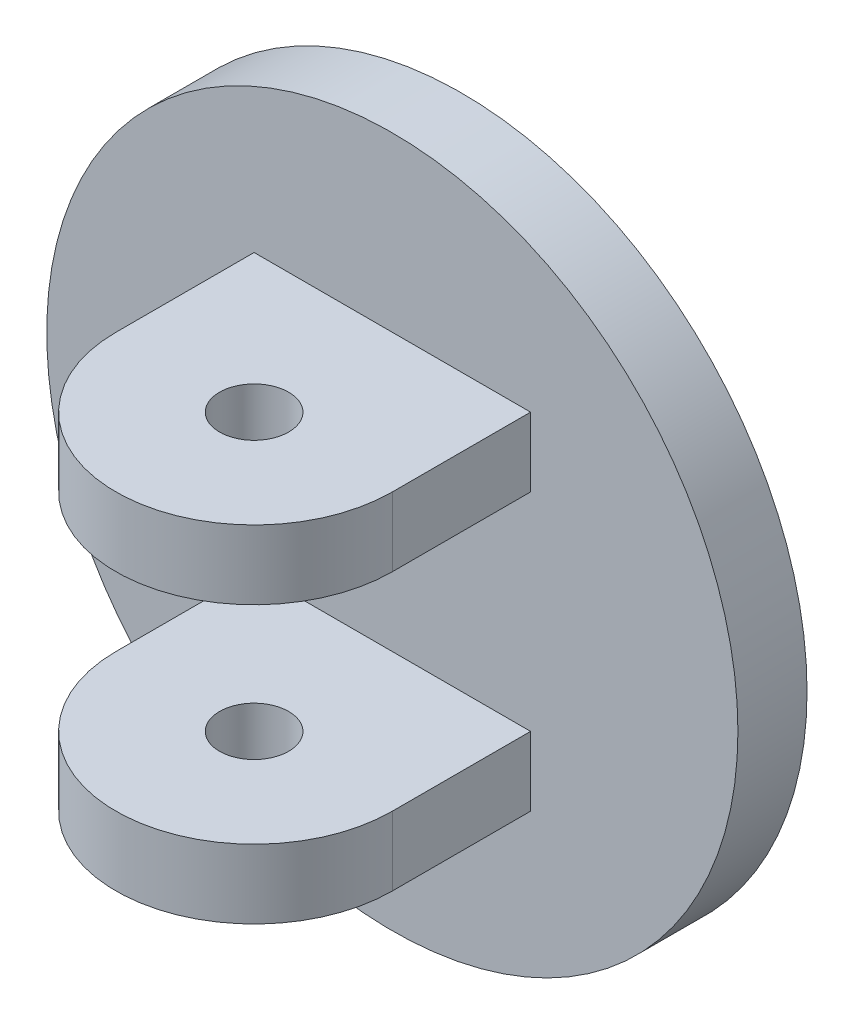
ISO-10303-21;
HEADER;
FILE_DESCRIPTION(('STEP AP214'),'2;1');
FILE_NAME('part.step','',(''),(''),'','','');
FILE_SCHEMA(('AUTOMOTIVE_DESIGN { 1 0 10303 214 1 1 1 1 }'));
ENDSEC;
DATA;
#1=APPLICATION_CONTEXT('core data for automotive mechanical design processes');
#2=APPLICATION_PROTOCOL_DEFINITION('international standard','automotive_design',2000,#1);
#3=PRODUCT_CONTEXT('',#1,'mechanical');
#4=PRODUCT('Part','Part','',(#3));
#5=PRODUCT_RELATED_PRODUCT_CATEGORY('part','',(#4));
#6=PRODUCT_DEFINITION_FORMATION('','',#4);
#7=PRODUCT_DEFINITION_CONTEXT('part definition',#1,'design');
#8=PRODUCT_DEFINITION('design','',#6,#7);
#9=PRODUCT_DEFINITION_SHAPE('','',#8);
#10=(LENGTH_UNIT() NAMED_UNIT(*) SI_UNIT(.MILLI.,.METRE.));
#11=(NAMED_UNIT(*) PLANE_ANGLE_UNIT() SI_UNIT($,.RADIAN.));
#12=(NAMED_UNIT(*) SI_UNIT($,.STERADIAN.) SOLID_ANGLE_UNIT());
#13=UNCERTAINTY_MEASURE_WITH_UNIT(LENGTH_MEASURE(1.E-05),#10,'distance_accuracy_value','');
#14=(GEOMETRIC_REPRESENTATION_CONTEXT(3) GLOBAL_UNCERTAINTY_ASSIGNED_CONTEXT((#13)) GLOBAL_UNIT_ASSIGNED_CONTEXT((#10,
#11,#12)) REPRESENTATION_CONTEXT('',''));
#15=CARTESIAN_POINT('',(0.,0.,0.));
#16=DIRECTION('',(0.,0.,1.));
#17=DIRECTION('',(1.,0.,0.));
#18=AXIS2_PLACEMENT_3D('',#15,#16,#17);
#19=CARTESIAN_POINT('',(20.,15.,50.));
#20=DIRECTION('',(-1.,0.,0.));
#21=DIRECTION('',(0.,0.,1.));
#22=AXIS2_PLACEMENT_3D('',#19,#20,#21);
#23=PLANE('',#22);
#24=DIRECTION('',(0.,1.,0.));
#25=VECTOR('',#24,1.);
#26=CARTESIAN_POINT('',(20.,-76.,30.));
#27=LINE('',#26,#25);
#28=CARTESIAN_POINT('',(20.,15.,30.));
#29=VERTEX_POINT('',#28);
#30=CARTESIAN_POINT('',(20.,25.,30.));
#31=VERTEX_POINT('',#30);
#32=EDGE_CURVE('E110',#29,#31,#27,.T.);
#33=ORIENTED_EDGE('',*,*,#32,.F.);
#34=DIRECTION('',(0.,0.,-1.));
#35=VECTOR('',#34,1.);
#36=CARTESIAN_POINT('',(20.,15.,50.));
#37=LINE('',#36,#35);
#38=CARTESIAN_POINT('',(20.,15.,10.));
#39=VERTEX_POINT('',#38);
#40=EDGE_CURVE('E143',#29,#39,#37,.T.);
#41=ORIENTED_EDGE('',*,*,#40,.T.);
#42=DIRECTION('',(0.,1.,0.));
#43=VECTOR('',#42,1.);
#44=CARTESIAN_POINT('',(20.,15.,10.));
#45=LINE('',#44,#43);
#46=CARTESIAN_POINT('',(20.,25.,10.));
#47=VERTEX_POINT('',#46);
#48=EDGE_CURVE('E127',#39,#47,#45,.T.);
#49=ORIENTED_EDGE('',*,*,#48,.T.);
#50=DIRECTION('',(0.,0.,-1.));
#51=VECTOR('',#50,1.);
#52=CARTESIAN_POINT('',(20.,25.,50.));
#53=LINE('',#52,#51);
#54=EDGE_CURVE('E149',#31,#47,#53,.T.);
#55=ORIENTED_EDGE('',*,*,#54,.F.);
#56=EDGE_LOOP('',(#33,#41,#49,#55));
#57=FACE_BOUND('',#56,.T.);
#58=ADVANCED_FACE('F33',(#57),#23,.F.);
#59=CARTESIAN_POINT('',(0.,25.,50.));
#60=DIRECTION('',(0.,-1.,0.));
#61=DIRECTION('',(1.,0.,0.));
#62=AXIS2_PLACEMENT_3D('',#59,#60,#61);
#63=PLANE('',#62);
#64=CARTESIAN_POINT('',(0.,25.,30.));
#65=DIRECTION('',(0.,-1.,0.));
#66=DIRECTION('',(1.,0.,0.));
#67=AXIS2_PLACEMENT_3D('',#64,#65,#66);
#68=CIRCLE('',#67,5.);
#69=CARTESIAN_POINT('',(5.,25.,30.));
#70=VERTEX_POINT('',#69);
#71=EDGE_CURVE('E201',#70,#70,#68,.F.);
#72=ORIENTED_EDGE('',*,*,#71,.F.);
#73=EDGE_LOOP('',(#72));
#74=FACE_BOUND('',#73,.T.);
#75=CARTESIAN_POINT('',(0.,25.,30.));
#76=DIRECTION('',(0.,-1.,0.));
#77=DIRECTION('',(1.,0.,0.));
#78=AXIS2_PLACEMENT_3D('',#75,#76,#77);
#79=CIRCLE('',#78,20.);
#80=CARTESIAN_POINT('',(-20.,25.,30.));
#81=VERTEX_POINT('',#80);
#82=EDGE_CURVE('E211',#31,#81,#79,.T.);
#83=ORIENTED_EDGE('',*,*,#82,.F.);
#84=ORIENTED_EDGE('',*,*,#54,.T.);
#85=DIRECTION('',(-1.,0.,0.));
#86=VECTOR('',#85,1.);
#87=CARTESIAN_POINT('',(0.,25.,10.));
#88=LINE('',#87,#86);
#89=CARTESIAN_POINT('',(-20.,25.,10.));
#90=VERTEX_POINT('',#89);
#91=EDGE_CURVE('E134',#47,#90,#88,.T.);
#92=ORIENTED_EDGE('',*,*,#91,.T.);
#93=DIRECTION('',(0.,0.,-1.));
#94=VECTOR('',#93,1.);
#95=CARTESIAN_POINT('',(-20.,25.,50.));
#96=LINE('',#95,#94);
#97=EDGE_CURVE('E147',#81,#90,#96,.T.);
#98=ORIENTED_EDGE('',*,*,#97,.F.);
#99=EDGE_LOOP('',(#83,#84,#92,#98));
#100=FACE_BOUND('',#99,.T.);
#101=ADVANCED_FACE('F168',(#74,#100),#63,.F.);
#102=CARTESIAN_POINT('',(-20.,15.,50.));
#103=DIRECTION('',(1.,0.,0.));
#104=DIRECTION('',(0.,0.,-1.));
#105=AXIS2_PLACEMENT_3D('',#102,#103,#104);
#106=PLANE('',#105);
#107=DIRECTION('',(0.,1.,0.));
#108=VECTOR('',#107,1.);
#109=CARTESIAN_POINT('',(-20.,-76.,30.));
#110=LINE('',#109,#108);
#111=CARTESIAN_POINT('',(-20.,15.,30.));
#112=VERTEX_POINT('',#111);
#113=EDGE_CURVE('E50',#112,#81,#110,.T.);
#114=ORIENTED_EDGE('',*,*,#113,.T.);
#115=ORIENTED_EDGE('',*,*,#97,.T.);
#116=DIRECTION('',(0.,-1.,0.));
#117=VECTOR('',#116,1.);
#118=CARTESIAN_POINT('',(-20.,15.,10.));
#119=LINE('',#118,#117);
#120=CARTESIAN_POINT('',(-20.,15.,10.));
#121=VERTEX_POINT('',#120);
#122=EDGE_CURVE('E137',#90,#121,#119,.T.);
#123=ORIENTED_EDGE('',*,*,#122,.T.);
#124=DIRECTION('',(0.,0.,-1.));
#125=VECTOR('',#124,1.);
#126=CARTESIAN_POINT('',(-20.,15.,50.));
#127=LINE('',#126,#125);
#128=EDGE_CURVE('E145',#112,#121,#127,.T.);
#129=ORIENTED_EDGE('',*,*,#128,.F.);
#130=EDGE_LOOP('',(#114,#115,#123,#129));
#131=FACE_BOUND('',#130,.T.);
#132=ADVANCED_FACE('F174',(#131),#106,.F.);
#133=CARTESIAN_POINT('',(0.,15.,50.));
#134=DIRECTION('',(0.,1.,0.));
#135=DIRECTION('',(0.,0.,1.));
#136=AXIS2_PLACEMENT_3D('',#133,#134,#135);
#137=PLANE('',#136);
#138=CARTESIAN_POINT('',(0.,15.,30.));
#139=DIRECTION('',(0.,1.,0.));
#140=DIRECTION('',(0.,0.,1.));
#141=AXIS2_PLACEMENT_3D('',#138,#139,#140);
#142=CIRCLE('',#141,5.);
#143=CARTESIAN_POINT('',(0.,15.,35.));
#144=VERTEX_POINT('',#143);
#145=EDGE_CURVE('E216',#144,#144,#142,.F.);
#146=ORIENTED_EDGE('',*,*,#145,.F.);
#147=EDGE_LOOP('',(#146));
#148=FACE_BOUND('',#147,.T.);
#149=ORIENTED_EDGE('',*,*,#40,.F.);
#150=CARTESIAN_POINT('',(0.,15.,30.));
#151=DIRECTION('',(0.,1.,0.));
#152=DIRECTION('',(0.,0.,1.));
#153=AXIS2_PLACEMENT_3D('',#150,#151,#152);
#154=CIRCLE('',#153,20.);
#155=EDGE_CURVE('E205',#112,#29,#154,.T.);
#156=ORIENTED_EDGE('',*,*,#155,.F.);
#157=ORIENTED_EDGE('',*,*,#128,.T.);
#158=DIRECTION('',(1.,0.,0.));
#159=VECTOR('',#158,1.);
#160=CARTESIAN_POINT('',(0.,15.,10.));
#161=LINE('',#160,#159);
#162=EDGE_CURVE('E140',#121,#39,#161,.T.);
#163=ORIENTED_EDGE('',*,*,#162,.T.);
#164=EDGE_LOOP('',(#149,#156,#157,#163));
#165=FACE_BOUND('',#164,.T.);
#166=ADVANCED_FACE('F228',(#148,#165),#137,.F.);
#167=CARTESIAN_POINT('',(-20.,-15.,50.));
#168=DIRECTION('',(1.,0.,0.));
#169=DIRECTION('',(0.,0.,-1.));
#170=AXIS2_PLACEMENT_3D('',#167,#168,#169);
#171=PLANE('',#170);
#172=CARTESIAN_POINT('',(-20.,-25.,30.));
#173=VERTEX_POINT('',#172);
#174=CARTESIAN_POINT('',(-20.,-15.,30.));
#175=VERTEX_POINT('',#174);
#176=EDGE_CURVE('E101',#173,#175,#110,.T.);
#177=ORIENTED_EDGE('',*,*,#176,.T.);
#178=DIRECTION('',(0.,0.,-1.));
#179=VECTOR('',#178,1.);
#180=CARTESIAN_POINT('',(-20.,-15.,50.));
#181=LINE('',#180,#179);
#182=CARTESIAN_POINT('',(-20.,-15.,10.));
#183=VERTEX_POINT('',#182);
#184=EDGE_CURVE('E125',#175,#183,#181,.T.);
#185=ORIENTED_EDGE('',*,*,#184,.T.);
#186=DIRECTION('',(0.,-1.,0.));
#187=VECTOR('',#186,1.);
#188=CARTESIAN_POINT('',(-20.,-15.,10.));
#189=LINE('',#188,#187);
#190=CARTESIAN_POINT('',(-20.,-25.,10.));
#191=VERTEX_POINT('',#190);
#192=EDGE_CURVE('E123',#183,#191,#189,.T.);
#193=ORIENTED_EDGE('',*,*,#192,.T.);
#194=DIRECTION('',(0.,0.,-1.));
#195=VECTOR('',#194,1.);
#196=CARTESIAN_POINT('',(-20.,-25.,50.));
#197=LINE('',#196,#195);
#198=EDGE_CURVE('E116',#173,#191,#197,.T.);
#199=ORIENTED_EDGE('',*,*,#198,.F.);
#200=EDGE_LOOP('',(#177,#185,#193,#199));
#201=FACE_BOUND('',#200,.T.);
#202=ADVANCED_FACE('F121',(#201),#171,.F.);
#203=CARTESIAN_POINT('',(0.,-25.,50.));
#204=DIRECTION('',(0.,1.,0.));
#205=DIRECTION('',(0.,0.,1.));
#206=AXIS2_PLACEMENT_3D('',#203,#204,#205);
#207=PLANE('',#206);
#208=CARTESIAN_POINT('',(0.,-25.,30.));
#209=DIRECTION('',(0.,1.,0.));
#210=DIRECTION('',(0.,0.,1.));
#211=AXIS2_PLACEMENT_3D('',#208,#209,#210);
#212=CIRCLE('',#211,5.);
#213=CARTESIAN_POINT('',(0.,-25.,35.));
#214=VERTEX_POINT('',#213);
#215=EDGE_CURVE('E213',#214,#214,#212,.F.);
#216=ORIENTED_EDGE('',*,*,#215,.F.);
#217=EDGE_LOOP('',(#216));
#218=FACE_BOUND('',#217,.T.);
#219=DIRECTION('',(0.,0.,-1.));
#220=VECTOR('',#219,1.);
#221=CARTESIAN_POINT('',(20.,-25.,50.));
#222=LINE('',#221,#220);
#223=CARTESIAN_POINT('',(20.,-25.,30.));
#224=VERTEX_POINT('',#223);
#225=CARTESIAN_POINT('',(20.,-25.,10.));
#226=VERTEX_POINT('',#225);
#227=EDGE_CURVE('E118',#224,#226,#222,.T.);
#228=ORIENTED_EDGE('',*,*,#227,.F.);
#229=CARTESIAN_POINT('',(0.,-25.,30.));
#230=DIRECTION('',(0.,1.,0.));
#231=DIRECTION('',(0.,0.,1.));
#232=AXIS2_PLACEMENT_3D('',#229,#230,#231);
#233=CIRCLE('',#232,20.);
#234=EDGE_CURVE('E104',#173,#224,#233,.T.);
#235=ORIENTED_EDGE('',*,*,#234,.F.);
#236=ORIENTED_EDGE('',*,*,#198,.T.);
#237=DIRECTION('',(1.,0.,0.));
#238=VECTOR('',#237,1.);
#239=CARTESIAN_POINT('',(0.,-25.,10.));
#240=LINE('',#239,#238);
#241=EDGE_CURVE('E195',#191,#226,#240,.T.);
#242=ORIENTED_EDGE('',*,*,#241,.T.);
#243=EDGE_LOOP('',(#228,#235,#236,#242));
#244=FACE_BOUND('',#243,.T.);
#245=ADVANCED_FACE('F114',(#218,#244),#207,.F.);
#246=CARTESIAN_POINT('',(20.,-15.,50.));
#247=DIRECTION('',(-1.,0.,0.));
#248=DIRECTION('',(0.,0.,1.));
#249=AXIS2_PLACEMENT_3D('',#246,#247,#248);
#250=PLANE('',#249);
#251=CARTESIAN_POINT('',(20.,-15.,30.));
#252=VERTEX_POINT('',#251);
#253=EDGE_CURVE('E119',#224,#252,#27,.T.);
#254=ORIENTED_EDGE('',*,*,#253,.F.);
#255=ORIENTED_EDGE('',*,*,#227,.T.);
#256=DIRECTION('',(0.,1.,0.));
#257=VECTOR('',#256,1.);
#258=CARTESIAN_POINT('',(20.,-15.,10.));
#259=LINE('',#258,#257);
#260=CARTESIAN_POINT('',(20.,-15.,10.));
#261=VERTEX_POINT('',#260);
#262=EDGE_CURVE('E197',#226,#261,#259,.T.);
#263=ORIENTED_EDGE('',*,*,#262,.T.);
#264=DIRECTION('',(0.,0.,-1.));
#265=VECTOR('',#264,1.);
#266=CARTESIAN_POINT('',(20.,-15.,50.));
#267=LINE('',#266,#265);
#268=EDGE_CURVE('E58',#252,#261,#267,.T.);
#269=ORIENTED_EDGE('',*,*,#268,.F.);
#270=EDGE_LOOP('',(#254,#255,#263,#269));
#271=FACE_BOUND('',#270,.T.);
#272=ADVANCED_FACE('F185',(#271),#250,.F.);
#273=CARTESIAN_POINT('',(0.,-15.,50.));
#274=DIRECTION('',(0.,-1.,0.));
#275=DIRECTION('',(0.,0.,-1.));
#276=AXIS2_PLACEMENT_3D('',#273,#274,#275);
#277=PLANE('',#276);
#278=CARTESIAN_POINT('',(0.,-15.,30.));
#279=DIRECTION('',(0.,-1.,0.));
#280=DIRECTION('',(0.,0.,-1.));
#281=AXIS2_PLACEMENT_3D('',#278,#279,#280);
#282=CIRCLE('',#281,5.);
#283=CARTESIAN_POINT('',(0.,-15.,25.));
#284=VERTEX_POINT('',#283);
#285=EDGE_CURVE('E37',#284,#284,#282,.F.);
#286=ORIENTED_EDGE('',*,*,#285,.F.);
#287=EDGE_LOOP('',(#286));
#288=FACE_BOUND('',#287,.T.);
#289=CARTESIAN_POINT('',(0.,-15.,30.));
#290=DIRECTION('',(0.,-1.,0.));
#291=DIRECTION('',(0.,0.,-1.));
#292=AXIS2_PLACEMENT_3D('',#289,#290,#291);
#293=CIRCLE('',#292,20.);
#294=EDGE_CURVE('E106',#252,#175,#293,.T.);
#295=ORIENTED_EDGE('',*,*,#294,.F.);
#296=ORIENTED_EDGE('',*,*,#268,.T.);
#297=DIRECTION('',(-1.,0.,0.));
#298=VECTOR('',#297,1.);
#299=CARTESIAN_POINT('',(0.,-15.,10.));
#300=LINE('',#299,#298);
#301=EDGE_CURVE('E199',#261,#183,#300,.T.);
#302=ORIENTED_EDGE('',*,*,#301,.T.);
#303=ORIENTED_EDGE('',*,*,#184,.F.);
#304=EDGE_LOOP('',(#295,#296,#302,#303));
#305=FACE_BOUND('',#304,.T.);
#306=ADVANCED_FACE('F180',(#288,#305),#277,.F.);
#307=CARTESIAN_POINT('',(0.,0.,10.));
#308=DIRECTION('',(0.,0.,1.));
#309=DIRECTION('',(1.,0.,0.));
#310=AXIS2_PLACEMENT_3D('',#307,#308,#309);
#311=PLANE('',#310);
#312=CARTESIAN_POINT('',(0.,0.,10.));
#313=DIRECTION('',(0.,0.,1.));
#314=DIRECTION('',(1.,0.,0.));
#315=AXIS2_PLACEMENT_3D('',#312,#313,#314);
#316=CIRCLE('',#315,50.);
#317=CARTESIAN_POINT('',(50.,0.,10.));
#318=VERTEX_POINT('',#317);
#319=EDGE_CURVE('E11',#318,#318,#316,.T.);
#320=ORIENTED_EDGE('',*,*,#319,.T.);
#321=EDGE_LOOP('',(#320));
#322=FACE_BOUND('',#321,.T.);
#323=ORIENTED_EDGE('',*,*,#91,.F.);
#324=ORIENTED_EDGE('',*,*,#48,.F.);
#325=ORIENTED_EDGE('',*,*,#162,.F.);
#326=ORIENTED_EDGE('',*,*,#122,.F.);
#327=EDGE_LOOP('',(#323,#324,#325,#326));
#328=FACE_BOUND('',#327,.T.);
#329=ORIENTED_EDGE('',*,*,#241,.F.);
#330=ORIENTED_EDGE('',*,*,#192,.F.);
#331=ORIENTED_EDGE('',*,*,#301,.F.);
#332=ORIENTED_EDGE('',*,*,#262,.F.);
#333=EDGE_LOOP('',(#329,#330,#331,#332));
#334=FACE_BOUND('',#333,.T.);
#335=ADVANCED_FACE('F164',(#322,#328,#334),#311,.T.);
#336=CARTESIAN_POINT('',(0.,0.,10.));
#337=DIRECTION('',(0.,0.,-1.));
#338=DIRECTION('',(-1.,0.,0.));
#339=AXIS2_PLACEMENT_3D('',#336,#337,#338);
#340=CYLINDRICAL_SURFACE('',#339,50.);
#341=ORIENTED_EDGE('',*,*,#319,.F.);
#342=EDGE_LOOP('',(#341));
#343=FACE_BOUND('',#342,.T.);
#344=CARTESIAN_POINT('',(0.,0.,0.));
#345=DIRECTION('',(0.,0.,1.));
#346=DIRECTION('',(1.,0.,0.));
#347=AXIS2_PLACEMENT_3D('',#344,#345,#346);
#348=CIRCLE('',#347,50.);
#349=CARTESIAN_POINT('',(50.,0.,0.));
#350=VERTEX_POINT('',#349);
#351=EDGE_CURVE('E42',#350,#350,#348,.T.);
#352=ORIENTED_EDGE('',*,*,#351,.T.);
#353=EDGE_LOOP('',(#352));
#354=FACE_BOUND('',#353,.T.);
#355=ADVANCED_FACE('F35',(#343,#354),#340,.T.);
#356=CARTESIAN_POINT('',(0.,0.,0.));
#357=DIRECTION('',(0.,0.,1.));
#358=DIRECTION('',(1.,0.,0.));
#359=AXIS2_PLACEMENT_3D('',#356,#357,#358);
#360=PLANE('',#359);
#361=ORIENTED_EDGE('',*,*,#351,.F.);
#362=EDGE_LOOP('',(#361));
#363=FACE_BOUND('',#362,.T.);
#364=ADVANCED_FACE('F154',(#363),#360,.F.);
#365=CARTESIAN_POINT('',(0.,35.,30.));
#366=DIRECTION('',(0.,-1.,0.));
#367=DIRECTION('',(1.,0.,0.));
#368=AXIS2_PLACEMENT_3D('',#365,#366,#367);
#369=CYLINDRICAL_SURFACE('',#368,5.);
#370=ORIENTED_EDGE('',*,*,#285,.T.);
#371=EDGE_LOOP('',(#370));
#372=FACE_BOUND('',#371,.T.);
#373=ORIENTED_EDGE('',*,*,#215,.T.);
#374=EDGE_LOOP('',(#373));
#375=FACE_BOUND('',#374,.T.);
#376=ADVANCED_FACE('F156',(#372,#375),#369,.F.);
#377=ORIENTED_EDGE('',*,*,#145,.T.);
#378=EDGE_LOOP('',(#377));
#379=FACE_BOUND('',#378,.T.);
#380=ORIENTED_EDGE('',*,*,#71,.T.);
#381=EDGE_LOOP('',(#380));
#382=FACE_BOUND('',#381,.T.);
#383=ADVANCED_FACE('F161',(#379,#382),#369,.F.);
#384=CARTESIAN_POINT('',(0.,-76.,30.));
#385=DIRECTION('',(0.,1.,0.));
#386=DIRECTION('',(0.,0.,1.));
#387=AXIS2_PLACEMENT_3D('',#384,#385,#386);
#388=CYLINDRICAL_SURFACE('',#387,20.);
#389=ORIENTED_EDGE('',*,*,#234,.T.);
#390=ORIENTED_EDGE('',*,*,#253,.T.);
#391=ORIENTED_EDGE('',*,*,#294,.T.);
#392=ORIENTED_EDGE('',*,*,#176,.F.);
#393=EDGE_LOOP('',(#389,#390,#391,#392));
#394=FACE_BOUND('',#393,.T.);
#395=ADVANCED_FACE('F103',(#394),#388,.T.);
#396=ORIENTED_EDGE('',*,*,#82,.T.);
#397=ORIENTED_EDGE('',*,*,#113,.F.);
#398=ORIENTED_EDGE('',*,*,#155,.T.);
#399=ORIENTED_EDGE('',*,*,#32,.T.);
#400=EDGE_LOOP('',(#396,#397,#398,#399));
#401=FACE_BOUND('',#400,.T.);
#402=ADVANCED_FACE('F247',(#401),#388,.T.);
#403=CLOSED_SHELL('',(#58,#101,#132,#166,#202,#245,#272,#306,#335,#355,#364,#376,#383,#395,#402));
#404=MANIFOLD_SOLID_BREP('B2',#403);
#405=ADVANCED_BREP_SHAPE_REPRESENTATION('',(#18,#404),#14);
#406=SHAPE_DEFINITION_REPRESENTATION(#9,#405);
ENDSEC;
END-ISO-10303-21;
